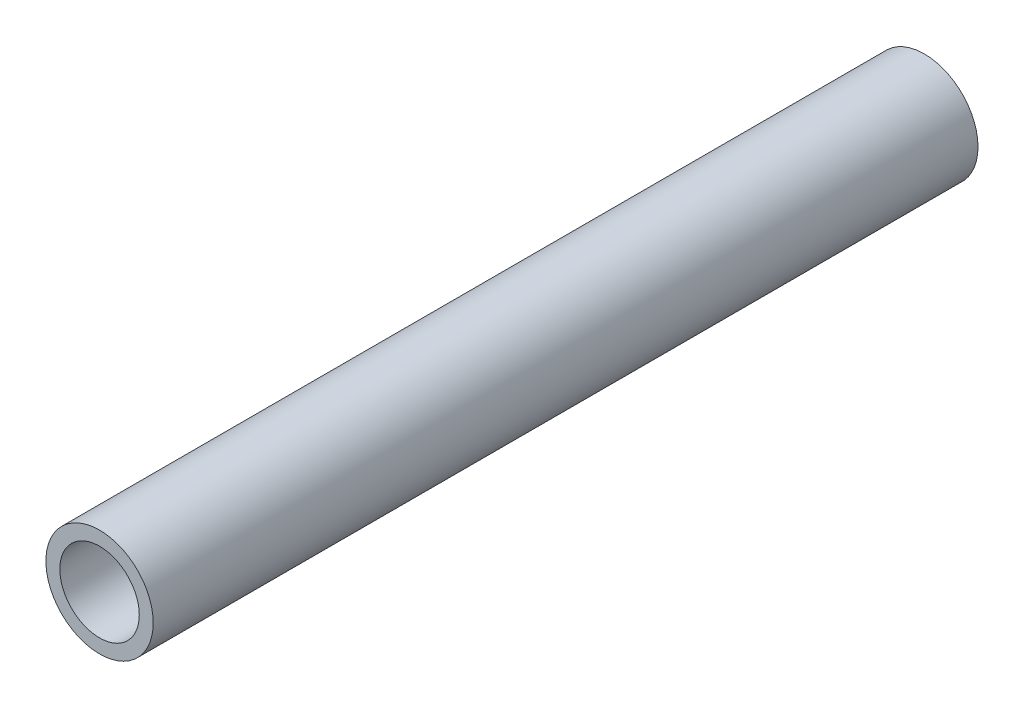
ISO-10303-21;
HEADER;
FILE_DESCRIPTION(('STEP AP214'),'2;1');
FILE_NAME('part.step','',(''),(''),'','','');
FILE_SCHEMA(('AUTOMOTIVE_DESIGN { 1 0 10303 214 1 1 1 1 }'));
ENDSEC;
DATA;
#1=APPLICATION_CONTEXT('core data for automotive mechanical design processes');
#2=APPLICATION_PROTOCOL_DEFINITION('international standard','automotive_design',2000,#1);
#3=PRODUCT_CONTEXT('',#1,'mechanical');
#4=PRODUCT('Part','Part','',(#3));
#5=PRODUCT_RELATED_PRODUCT_CATEGORY('part','',(#4));
#6=PRODUCT_DEFINITION_FORMATION('','',#4);
#7=PRODUCT_DEFINITION_CONTEXT('part definition',#1,'design');
#8=PRODUCT_DEFINITION('design','',#6,#7);
#9=PRODUCT_DEFINITION_SHAPE('','',#8);
#10=(LENGTH_UNIT() NAMED_UNIT(*) SI_UNIT(.MILLI.,.METRE.));
#11=(NAMED_UNIT(*) PLANE_ANGLE_UNIT() SI_UNIT($,.RADIAN.));
#12=(NAMED_UNIT(*) SI_UNIT($,.STERADIAN.) SOLID_ANGLE_UNIT());
#13=UNCERTAINTY_MEASURE_WITH_UNIT(LENGTH_MEASURE(1.E-05),#10,'distance_accuracy_value','');
#14=(GEOMETRIC_REPRESENTATION_CONTEXT(3) GLOBAL_UNCERTAINTY_ASSIGNED_CONTEXT((#13)) GLOBAL_UNIT_ASSIGNED_CONTEXT((#10,
#11,#12)) REPRESENTATION_CONTEXT('',''));
#15=CARTESIAN_POINT('',(0.,0.,0.));
#16=DIRECTION('',(0.,0.,1.));
#17=DIRECTION('',(1.,0.,0.));
#18=AXIS2_PLACEMENT_3D('',#15,#16,#17);
#19=CARTESIAN_POINT('',(0.,0.,82.));
#20=DIRECTION('',(0.,0.,1.));
#21=DIRECTION('',(1.,0.,0.));
#22=AXIS2_PLACEMENT_3D('',#19,#20,#21);
#23=PLANE('',#22);
#24=CARTESIAN_POINT('',(0.,0.,82.));
#25=DIRECTION('',(0.,0.,1.));
#26=DIRECTION('',(1.,0.,0.));
#27=AXIS2_PLACEMENT_3D('',#24,#25,#26);
#28=CIRCLE('',#27,10.668);
#29=CARTESIAN_POINT('',(10.668,0.,82.));
#30=VERTEX_POINT('',#29);
#31=EDGE_CURVE('E11',#30,#30,#28,.T.);
#32=ORIENTED_EDGE('',*,*,#31,.T.);
#33=EDGE_LOOP('',(#32));
#34=FACE_BOUND('',#33,.T.);
#35=CARTESIAN_POINT('',(0.,0.,82.));
#36=DIRECTION('',(0.,0.,1.));
#37=DIRECTION('',(1.,0.,0.));
#38=AXIS2_PLACEMENT_3D('',#35,#36,#37);
#39=CIRCLE('',#38,7.8994);
#40=CARTESIAN_POINT('',(7.8994,0.,82.));
#41=VERTEX_POINT('',#40);
#42=EDGE_CURVE('E56',#41,#41,#39,.T.);
#43=ORIENTED_EDGE('',*,*,#42,.F.);
#44=EDGE_LOOP('',(#43));
#45=FACE_BOUND('',#44,.T.);
#46=ADVANCED_FACE('F43',(#34,#45),#23,.T.);
#47=CARTESIAN_POINT('',(0.,0.,-82.));
#48=DIRECTION('',(0.,0.,1.));
#49=DIRECTION('',(1.,0.,0.));
#50=AXIS2_PLACEMENT_3D('',#47,#48,#49);
#51=PLANE('',#50);
#52=CARTESIAN_POINT('',(0.,0.,-82.));
#53=DIRECTION('',(0.,0.,1.));
#54=DIRECTION('',(1.,0.,0.));
#55=AXIS2_PLACEMENT_3D('',#52,#53,#54);
#56=CIRCLE('',#55,10.668);
#57=CARTESIAN_POINT('',(10.668,0.,-82.));
#58=VERTEX_POINT('',#57);
#59=EDGE_CURVE('E47',#58,#58,#56,.T.);
#60=ORIENTED_EDGE('',*,*,#59,.F.);
#61=EDGE_LOOP('',(#60));
#62=FACE_BOUND('',#61,.T.);
#63=CARTESIAN_POINT('',(0.,0.,-82.));
#64=DIRECTION('',(0.,0.,1.));
#65=DIRECTION('',(1.,0.,0.));
#66=AXIS2_PLACEMENT_3D('',#63,#64,#65);
#67=CIRCLE('',#66,7.8994);
#68=CARTESIAN_POINT('',(7.8994,0.,-82.));
#69=VERTEX_POINT('',#68);
#70=EDGE_CURVE('E58',#69,#69,#67,.T.);
#71=ORIENTED_EDGE('',*,*,#70,.T.);
#72=EDGE_LOOP('',(#71));
#73=FACE_BOUND('',#72,.T.);
#74=ADVANCED_FACE('F70',(#62,#73),#51,.F.);
#75=CARTESIAN_POINT('',(0.,0.,82.));
#76=DIRECTION('',(0.,0.,-1.));
#77=DIRECTION('',(-1.,0.,0.));
#78=AXIS2_PLACEMENT_3D('',#75,#76,#77);
#79=CYLINDRICAL_SURFACE('',#78,10.668);
#80=ORIENTED_EDGE('',*,*,#31,.F.);
#81=EDGE_LOOP('',(#80));
#82=FACE_BOUND('',#81,.T.);
#83=ORIENTED_EDGE('',*,*,#59,.T.);
#84=EDGE_LOOP('',(#83));
#85=FACE_BOUND('',#84,.T.);
#86=ADVANCED_FACE('F45',(#82,#85),#79,.T.);
#87=CARTESIAN_POINT('',(0.,0.,82.));
#88=DIRECTION('',(0.,0.,-1.));
#89=DIRECTION('',(-1.,0.,0.));
#90=AXIS2_PLACEMENT_3D('',#87,#88,#89);
#91=CYLINDRICAL_SURFACE('',#90,7.8994);
#92=ORIENTED_EDGE('',*,*,#42,.T.);
#93=EDGE_LOOP('',(#92));
#94=FACE_BOUND('',#93,.T.);
#95=ORIENTED_EDGE('',*,*,#70,.F.);
#96=EDGE_LOOP('',(#95));
#97=FACE_BOUND('',#96,.T.);
#98=ADVANCED_FACE('F66',(#94,#97),#91,.F.);
#99=CLOSED_SHELL('',(#46,#74,#86,#98));
#100=MANIFOLD_SOLID_BREP('B2',#99);
#101=ADVANCED_BREP_SHAPE_REPRESENTATION('',(#18,#100),#14);
#102=SHAPE_DEFINITION_REPRESENTATION(#9,#101);
ENDSEC;
END-ISO-10303-21;
